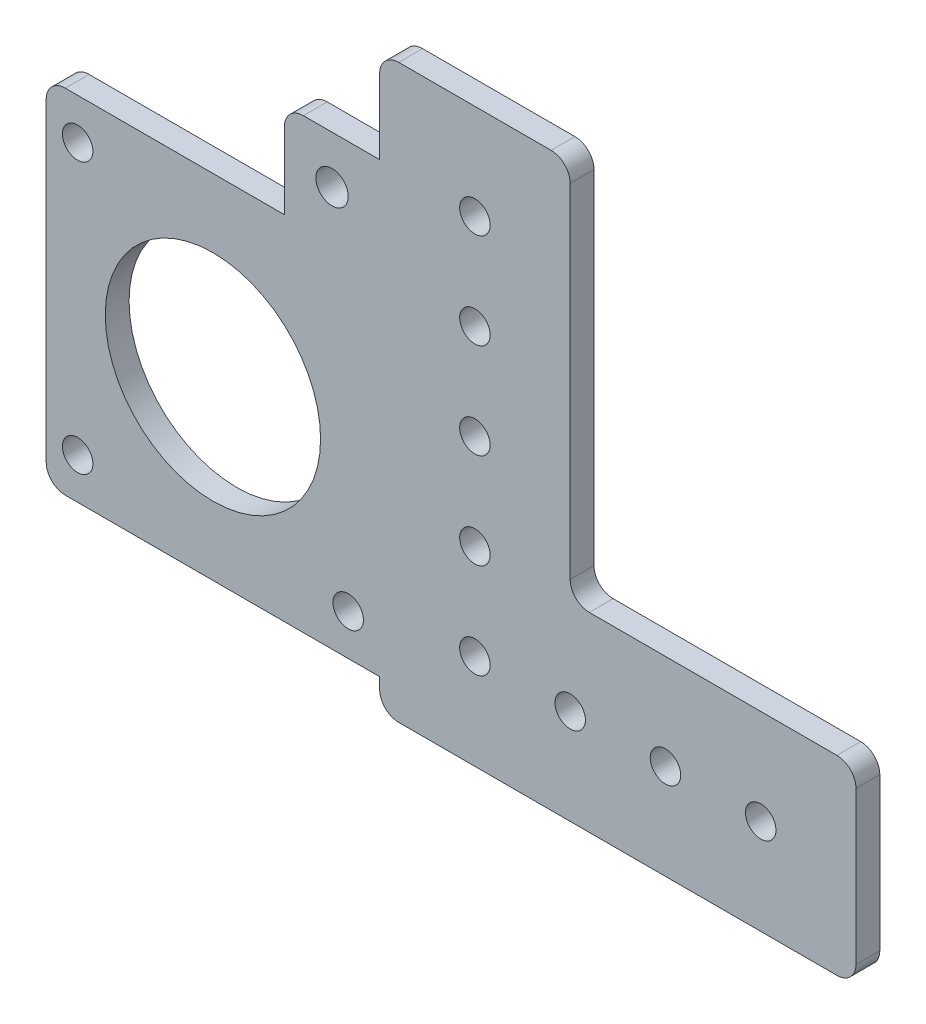
ISO-10303-21;
HEADER;
FILE_DESCRIPTION(('STEP AP214'),'2;1');
FILE_NAME('part.step','',(''),(''),'','','');
FILE_SCHEMA(('AUTOMOTIVE_DESIGN { 1 0 10303 214 1 1 1 1 }'));
ENDSEC;
DATA;
#1=APPLICATION_CONTEXT('core data for automotive mechanical design processes');
#2=APPLICATION_PROTOCOL_DEFINITION('international standard','automotive_design',2000,#1);
#3=PRODUCT_CONTEXT('',#1,'mechanical');
#4=PRODUCT('Part','Part','',(#3));
#5=PRODUCT_RELATED_PRODUCT_CATEGORY('part','',(#4));
#6=PRODUCT_DEFINITION_FORMATION('','',#4);
#7=PRODUCT_DEFINITION_CONTEXT('part definition',#1,'design');
#8=PRODUCT_DEFINITION('design','',#6,#7);
#9=PRODUCT_DEFINITION_SHAPE('','',#8);
#10=(LENGTH_UNIT() NAMED_UNIT(*) SI_UNIT(.MILLI.,.METRE.));
#11=(NAMED_UNIT(*) PLANE_ANGLE_UNIT() SI_UNIT($,.RADIAN.));
#12=(NAMED_UNIT(*) SI_UNIT($,.STERADIAN.) SOLID_ANGLE_UNIT());
#13=UNCERTAINTY_MEASURE_WITH_UNIT(LENGTH_MEASURE(1.E-05),#10,'distance_accuracy_value','');
#14=(GEOMETRIC_REPRESENTATION_CONTEXT(3) GLOBAL_UNCERTAINTY_ASSIGNED_CONTEXT((#13)) GLOBAL_UNIT_ASSIGNED_CONTEXT((#10,
#11,#12)) REPRESENTATION_CONTEXT('',''));
#15=CARTESIAN_POINT('',(0.,0.,0.));
#16=DIRECTION('',(0.,0.,1.));
#17=DIRECTION('',(1.,0.,0.));
#18=AXIS2_PLACEMENT_3D('',#15,#16,#17);
#19=CARTESIAN_POINT('',(12.7,0.,3.175));
#20=DIRECTION('',(-1.,0.,0.));
#21=DIRECTION('',(0.,-1.,0.));
#22=AXIS2_PLACEMENT_3D('',#19,#20,#21);
#23=PLANE('',#22);
#24=DIRECTION('',(0.,1.,0.));
#25=VECTOR('',#24,1.);
#26=CARTESIAN_POINT('',(12.7,0.,0.));
#27=LINE('',#26,#25);
#28=CARTESIAN_POINT('',(12.7,-10.16,0.));
#29=VERTEX_POINT('',#28);
#30=CARTESIAN_POINT('',(12.7,35.56,0.));
#31=VERTEX_POINT('',#30);
#32=EDGE_CURVE('E223',#29,#31,#27,.T.);
#33=ORIENTED_EDGE('',*,*,#32,.T.);
#34=DIRECTION('',(0.,0.,-1.));
#35=VECTOR('',#34,1.);
#36=CARTESIAN_POINT('',(12.7,35.56,3.175));
#37=LINE('',#36,#35);
#38=CARTESIAN_POINT('',(12.7,35.56,3.175));
#39=VERTEX_POINT('',#38);
#40=EDGE_CURVE('E310',#31,#39,#37,.F.);
#41=ORIENTED_EDGE('',*,*,#40,.T.);
#42=DIRECTION('',(0.,1.,0.));
#43=VECTOR('',#42,1.);
#44=CARTESIAN_POINT('',(12.7,0.,3.175));
#45=LINE('',#44,#43);
#46=CARTESIAN_POINT('',(12.7,-10.16,3.175));
#47=VERTEX_POINT('',#46);
#48=EDGE_CURVE('E408',#47,#39,#45,.T.);
#49=ORIENTED_EDGE('',*,*,#48,.F.);
#50=DIRECTION('',(0.,0.,1.));
#51=VECTOR('',#50,1.);
#52=CARTESIAN_POINT('',(12.7,-10.16,0.));
#53=LINE('',#52,#51);
#54=EDGE_CURVE('E308',#47,#29,#53,.F.);
#55=ORIENTED_EDGE('',*,*,#54,.T.);
#56=EDGE_LOOP('',(#33,#41,#49,#55));
#57=FACE_BOUND('',#56,.T.);
#58=ADVANCED_FACE('F34',(#57),#23,.F.);
#59=CARTESIAN_POINT('',(0.,-38.1,3.175));
#60=DIRECTION('',(0.,1.,0.));
#61=DIRECTION('',(0.,0.,1.));
#62=AXIS2_PLACEMENT_3D('',#59,#60,#61);
#63=PLANE('',#62);
#64=DIRECTION('',(1.,0.,0.));
#65=VECTOR('',#64,1.);
#66=CARTESIAN_POINT('',(0.,-38.1,3.175));
#67=LINE('',#66,#65);
#68=CARTESIAN_POINT('',(-10.16,-38.1,3.175));
#69=VERTEX_POINT('',#68);
#70=CARTESIAN_POINT('',(48.26,-38.1,3.175));
#71=VERTEX_POINT('',#70);
#72=EDGE_CURVE('E252',#69,#71,#67,.T.);
#73=ORIENTED_EDGE('',*,*,#72,.F.);
#74=DIRECTION('',(0.,0.,-1.));
#75=VECTOR('',#74,1.);
#76=CARTESIAN_POINT('',(-10.16,-38.1,0.));
#77=LINE('',#76,#75);
#78=CARTESIAN_POINT('',(-10.16,-38.1,0.));
#79=VERTEX_POINT('',#78);
#80=EDGE_CURVE('E257',#69,#79,#77,.T.);
#81=ORIENTED_EDGE('',*,*,#80,.T.);
#82=DIRECTION('',(1.,0.,0.));
#83=VECTOR('',#82,1.);
#84=CARTESIAN_POINT('',(0.,-38.1,0.));
#85=LINE('',#84,#83);
#86=CARTESIAN_POINT('',(48.26,-38.1,0.));
#87=VERTEX_POINT('',#86);
#88=EDGE_CURVE('E220',#79,#87,#85,.T.);
#89=ORIENTED_EDGE('',*,*,#88,.T.);
#90=DIRECTION('',(0.,0.,-1.));
#91=VECTOR('',#90,1.);
#92=CARTESIAN_POINT('',(48.26,-38.1,3.175));
#93=LINE('',#92,#91);
#94=EDGE_CURVE('E255',#87,#71,#93,.F.);
#95=ORIENTED_EDGE('',*,*,#94,.T.);
#96=EDGE_LOOP('',(#73,#81,#89,#95));
#97=FACE_BOUND('',#96,.T.);
#98=ADVANCED_FACE('F454',(#97),#63,.F.);
#99=CARTESIAN_POINT('',(0.,38.1,3.175));
#100=DIRECTION('',(0.,1.,0.));
#101=DIRECTION('',(0.,0.,1.));
#102=AXIS2_PLACEMENT_3D('',#99,#100,#101);
#103=PLANE('',#102);
#104=DIRECTION('',(1.,0.,0.));
#105=VECTOR('',#104,1.);
#106=CARTESIAN_POINT('',(0.,38.1,0.));
#107=LINE('',#106,#105);
#108=CARTESIAN_POINT('',(-10.16,38.1,0.));
#109=VERTEX_POINT('',#108);
#110=CARTESIAN_POINT('',(10.16,38.1,0.));
#111=VERTEX_POINT('',#110);
#112=EDGE_CURVE('E227',#109,#111,#107,.T.);
#113=ORIENTED_EDGE('',*,*,#112,.F.);
#114=DIRECTION('',(0.,0.,-1.));
#115=VECTOR('',#114,1.);
#116=CARTESIAN_POINT('',(-10.16,38.1,3.175));
#117=LINE('',#116,#115);
#118=CARTESIAN_POINT('',(-10.16,38.1,3.175));
#119=VERTEX_POINT('',#118);
#120=EDGE_CURVE('E306',#109,#119,#117,.F.);
#121=ORIENTED_EDGE('',*,*,#120,.T.);
#122=DIRECTION('',(1.,0.,0.));
#123=VECTOR('',#122,1.);
#124=CARTESIAN_POINT('',(0.,38.1,3.175));
#125=LINE('',#124,#123);
#126=CARTESIAN_POINT('',(10.16,38.1,3.175));
#127=VERTEX_POINT('',#126);
#128=EDGE_CURVE('E201',#119,#127,#125,.T.);
#129=ORIENTED_EDGE('',*,*,#128,.T.);
#130=DIRECTION('',(0.,0.,-1.));
#131=VECTOR('',#130,1.);
#132=CARTESIAN_POINT('',(10.16,38.1,0.));
#133=LINE('',#132,#131);
#134=EDGE_CURVE('E303',#127,#111,#133,.T.);
#135=ORIENTED_EDGE('',*,*,#134,.T.);
#136=EDGE_LOOP('',(#113,#121,#129,#135));
#137=FACE_BOUND('',#136,.T.);
#138=ADVANCED_FACE('F415',(#137),#103,.T.);
#139=CARTESIAN_POINT('',(-12.7,0.,3.175));
#140=DIRECTION('',(-1.,0.,0.));
#141=DIRECTION('',(0.,-1.,0.));
#142=AXIS2_PLACEMENT_3D('',#139,#140,#141);
#143=PLANE('',#142);
#144=DIRECTION('',(0.,0.,1.));
#145=VECTOR('',#144,1.);
#146=CARTESIAN_POINT('',(-12.7,25.595,-17.9605122421383));
#147=LINE('',#146,#145);
#148=CARTESIAN_POINT('',(-12.7,25.595,0.));
#149=VERTEX_POINT('',#148);
#150=CARTESIAN_POINT('',(-12.7,25.595,3.175));
#151=VERTEX_POINT('',#150);
#152=EDGE_CURVE('E190',#149,#151,#147,.T.);
#153=ORIENTED_EDGE('',*,*,#152,.T.);
#154=DIRECTION('',(0.,1.,0.));
#155=VECTOR('',#154,1.);
#156=CARTESIAN_POINT('',(-12.7,0.,3.175));
#157=LINE('',#156,#155);
#158=CARTESIAN_POINT('',(-12.7,35.56,3.175));
#159=VERTEX_POINT('',#158);
#160=EDGE_CURVE('E196',#151,#159,#157,.T.);
#161=ORIENTED_EDGE('',*,*,#160,.T.);
#162=DIRECTION('',(0.,0.,-1.));
#163=VECTOR('',#162,1.);
#164=CARTESIAN_POINT('',(-12.7,35.56,3.175));
#165=LINE('',#164,#163);
#166=CARTESIAN_POINT('',(-12.7,35.56,0.));
#167=VERTEX_POINT('',#166);
#168=EDGE_CURVE('E300',#159,#167,#165,.T.);
#169=ORIENTED_EDGE('',*,*,#168,.T.);
#170=DIRECTION('',(0.,1.,0.));
#171=VECTOR('',#170,1.);
#172=CARTESIAN_POINT('',(-12.7,0.,0.));
#173=LINE('',#172,#171);
#174=EDGE_CURVE('E230',#149,#167,#173,.T.);
#175=ORIENTED_EDGE('',*,*,#174,.F.);
#176=EDGE_LOOP('',(#153,#161,#169,#175));
#177=FACE_BOUND('',#176,.T.);
#178=ADVANCED_FACE('F583',(#177),#143,.T.);
#179=CARTESIAN_POINT('',(0.,12.895,3.175));
#180=DIRECTION('',(0.,1.,0.));
#181=DIRECTION('',(0.,0.,1.));
#182=AXIS2_PLACEMENT_3D('',#179,#180,#181);
#183=PLANE('',#182);
#184=DIRECTION('',(0.,0.,1.));
#185=VECTOR('',#184,1.);
#186=CARTESIAN_POINT('',(-25.4,12.895,-17.9605122421383));
#187=LINE('',#186,#185);
#188=CARTESIAN_POINT('',(-25.4,12.895,0.));
#189=VERTEX_POINT('',#188);
#190=CARTESIAN_POINT('',(-25.4,12.895,3.175));
#191=VERTEX_POINT('',#190);
#192=EDGE_CURVE('E184',#189,#191,#187,.T.);
#193=ORIENTED_EDGE('',*,*,#192,.F.);
#194=DIRECTION('',(1.,0.,0.));
#195=VECTOR('',#194,1.);
#196=CARTESIAN_POINT('',(0.,12.895,0.));
#197=LINE('',#196,#195);
#198=CARTESIAN_POINT('',(-54.61,12.895,0.));
#199=VERTEX_POINT('',#198);
#200=EDGE_CURVE('E232',#199,#189,#197,.T.);
#201=ORIENTED_EDGE('',*,*,#200,.F.);
#202=DIRECTION('',(0.,0.,-1.));
#203=VECTOR('',#202,1.);
#204=CARTESIAN_POINT('',(-54.61,12.895,3.175));
#205=LINE('',#204,#203);
#206=CARTESIAN_POINT('',(-54.61,12.895,3.175));
#207=VERTEX_POINT('',#206);
#208=EDGE_CURVE('E194',#199,#207,#205,.F.);
#209=ORIENTED_EDGE('',*,*,#208,.T.);
#210=DIRECTION('',(1.,0.,0.));
#211=VECTOR('',#210,1.);
#212=CARTESIAN_POINT('',(0.,12.895,3.175));
#213=LINE('',#212,#211);
#214=EDGE_CURVE('E178',#207,#191,#213,.T.);
#215=ORIENTED_EDGE('',*,*,#214,.T.);
#216=EDGE_LOOP('',(#193,#201,#209,#215));
#217=FACE_BOUND('',#216,.T.);
#218=ADVANCED_FACE('F192',(#217),#183,.T.);
#219=CARTESIAN_POINT('',(-57.15,0.,3.175));
#220=DIRECTION('',(-1.,0.,0.));
#221=DIRECTION('',(0.,0.,1.));
#222=AXIS2_PLACEMENT_3D('',#219,#220,#221);
#223=PLANE('',#222);
#224=DIRECTION('',(0.,1.,0.));
#225=VECTOR('',#224,1.);
#226=CARTESIAN_POINT('',(-57.15,0.,0.));
#227=LINE('',#226,#225);
#228=CARTESIAN_POINT('',(-57.15,-31.555,0.));
#229=VERTEX_POINT('',#228);
#230=CARTESIAN_POINT('',(-57.15,10.355,0.));
#231=VERTEX_POINT('',#230);
#232=EDGE_CURVE('E235',#229,#231,#227,.T.);
#233=ORIENTED_EDGE('',*,*,#232,.F.);
#234=DIRECTION('',(0.,0.,-1.));
#235=VECTOR('',#234,1.);
#236=CARTESIAN_POINT('',(-57.15,-31.555,3.175));
#237=LINE('',#236,#235);
#238=CARTESIAN_POINT('',(-57.15,-31.555,3.175));
#239=VERTEX_POINT('',#238);
#240=EDGE_CURVE('E297',#229,#239,#237,.F.);
#241=ORIENTED_EDGE('',*,*,#240,.T.);
#242=DIRECTION('',(0.,1.,0.));
#243=VECTOR('',#242,1.);
#244=CARTESIAN_POINT('',(-57.15,0.,3.175));
#245=LINE('',#244,#243);
#246=CARTESIAN_POINT('',(-57.15,10.355,3.175));
#247=VERTEX_POINT('',#246);
#248=EDGE_CURVE('E195',#239,#247,#245,.T.);
#249=ORIENTED_EDGE('',*,*,#248,.T.);
#250=DIRECTION('',(0.,0.,-1.));
#251=VECTOR('',#250,1.);
#252=CARTESIAN_POINT('',(-57.15,10.355,3.175));
#253=LINE('',#252,#251);
#254=EDGE_CURVE('E294',#247,#231,#253,.T.);
#255=ORIENTED_EDGE('',*,*,#254,.T.);
#256=EDGE_LOOP('',(#233,#241,#249,#255));
#257=FACE_BOUND('',#256,.T.);
#258=ADVANCED_FACE('F476',(#257),#223,.T.);
#259=CARTESIAN_POINT('',(0.,-34.095,3.175));
#260=DIRECTION('',(0.,1.,0.));
#261=DIRECTION('',(0.,0.,1.));
#262=AXIS2_PLACEMENT_3D('',#259,#260,#261);
#263=PLANE('',#262);
#264=DIRECTION('',(1.,0.,0.));
#265=VECTOR('',#264,1.);
#266=CARTESIAN_POINT('',(0.,-34.095,3.175));
#267=LINE('',#266,#265);
#268=CARTESIAN_POINT('',(-54.61,-34.095,3.175));
#269=VERTEX_POINT('',#268);
#270=CARTESIAN_POINT('',(-12.7,-34.095,3.175));
#271=VERTEX_POINT('',#270);
#272=EDGE_CURVE('E199',#269,#271,#267,.T.);
#273=ORIENTED_EDGE('',*,*,#272,.F.);
#274=DIRECTION('',(0.,0.,-1.));
#275=VECTOR('',#274,1.);
#276=CARTESIAN_POINT('',(-54.61,-34.095,0.));
#277=LINE('',#276,#275);
#278=CARTESIAN_POINT('',(-54.61,-34.095,0.));
#279=VERTEX_POINT('',#278);
#280=EDGE_CURVE('E291',#269,#279,#277,.T.);
#281=ORIENTED_EDGE('',*,*,#280,.T.);
#282=DIRECTION('',(1.,0.,0.));
#283=VECTOR('',#282,1.);
#284=CARTESIAN_POINT('',(0.,-34.095,0.));
#285=LINE('',#284,#283);
#286=CARTESIAN_POINT('',(-12.7,-34.095,0.));
#287=VERTEX_POINT('',#286);
#288=EDGE_CURVE('E238',#279,#287,#285,.T.);
#289=ORIENTED_EDGE('',*,*,#288,.T.);
#290=DIRECTION('',(0.,0.,-1.));
#291=VECTOR('',#290,1.);
#292=CARTESIAN_POINT('',(-12.7,-34.095,3.175));
#293=LINE('',#292,#291);
#294=EDGE_CURVE('E219',#271,#287,#293,.T.);
#295=ORIENTED_EDGE('',*,*,#294,.F.);
#296=EDGE_LOOP('',(#273,#281,#289,#295));
#297=FACE_BOUND('',#296,.T.);
#298=ADVANCED_FACE('F470',(#297),#263,.F.);
#299=CARTESIAN_POINT('',(-16.891,-28.634,3.175));
#300=DIRECTION('',(0.,0.,-1.));
#301=DIRECTION('',(-1.,0.,0.));
#302=AXIS2_PLACEMENT_3D('',#299,#300,#301);
#303=CYLINDRICAL_SURFACE('',#302,2.03200000000001);
#304=CARTESIAN_POINT('',(-16.891,-28.634,3.175));
#305=DIRECTION('',(0.,0.,1.));
#306=DIRECTION('',(1.,0.,0.));
#307=AXIS2_PLACEMENT_3D('',#304,#305,#306);
#308=CIRCLE('',#307,2.03200000000001);
#309=CARTESIAN_POINT('',(-14.859,-28.634,3.175));
#310=VERTEX_POINT('',#309);
#311=EDGE_CURVE('E213',#310,#310,#308,.T.);
#312=ORIENTED_EDGE('',*,*,#311,.T.);
#313=EDGE_LOOP('',(#312));
#314=FACE_BOUND('',#313,.T.);
#315=CARTESIAN_POINT('',(-16.891,-28.634,0.));
#316=DIRECTION('',(0.,0.,1.));
#317=DIRECTION('',(1.,0.,0.));
#318=AXIS2_PLACEMENT_3D('',#315,#316,#317);
#319=CIRCLE('',#318,2.03200000000001);
#320=CARTESIAN_POINT('',(-14.859,-28.634,0.));
#321=VERTEX_POINT('',#320);
#322=EDGE_CURVE('E246',#321,#321,#319,.T.);
#323=ORIENTED_EDGE('',*,*,#322,.F.);
#324=EDGE_LOOP('',(#323));
#325=FACE_BOUND('',#324,.T.);
#326=ADVANCED_FACE('F569',(#314,#325),#303,.F.);
#327=CARTESIAN_POINT('',(-52.959,7.434,3.175));
#328=DIRECTION('',(0.,0.,-1.));
#329=DIRECTION('',(-1.,0.,0.));
#330=AXIS2_PLACEMENT_3D('',#327,#328,#329);
#331=CYLINDRICAL_SURFACE('',#330,2.03200000000001);
#332=CARTESIAN_POINT('',(-52.959,7.434,3.175));
#333=DIRECTION('',(0.,0.,1.));
#334=DIRECTION('',(1.,0.,0.));
#335=AXIS2_PLACEMENT_3D('',#332,#333,#334);
#336=CIRCLE('',#335,2.03200000000001);
#337=CARTESIAN_POINT('',(-50.927,7.434,3.175));
#338=VERTEX_POINT('',#337);
#339=EDGE_CURVE('E210',#338,#338,#336,.T.);
#340=ORIENTED_EDGE('',*,*,#339,.T.);
#341=EDGE_LOOP('',(#340));
#342=FACE_BOUND('',#341,.T.);
#343=CARTESIAN_POINT('',(-52.959,7.434,0.));
#344=DIRECTION('',(0.,0.,1.));
#345=DIRECTION('',(1.,0.,0.));
#346=AXIS2_PLACEMENT_3D('',#343,#344,#345);
#347=CIRCLE('',#346,2.03200000000001);
#348=CARTESIAN_POINT('',(-50.927,7.434,0.));
#349=VERTEX_POINT('',#348);
#350=EDGE_CURVE('E243',#349,#349,#347,.T.);
#351=ORIENTED_EDGE('',*,*,#350,.F.);
#352=EDGE_LOOP('',(#351));
#353=FACE_BOUND('',#352,.T.);
#354=ADVANCED_FACE('F572',(#342,#353),#331,.F.);
#355=CARTESIAN_POINT('',(-34.925,-10.6,3.175));
#356=DIRECTION('',(0.,0.,-1.));
#357=DIRECTION('',(-1.,0.,0.));
#358=AXIS2_PLACEMENT_3D('',#355,#356,#357);
#359=CYLINDRICAL_SURFACE('',#358,14.351);
#360=CARTESIAN_POINT('',(-34.925,-10.6,3.175));
#361=DIRECTION('',(0.,0.,1.));
#362=DIRECTION('',(1.,0.,0.));
#363=AXIS2_PLACEMENT_3D('',#360,#361,#362);
#364=CIRCLE('',#363,14.351);
#365=CARTESIAN_POINT('',(-20.574,-10.6,3.175));
#366=VERTEX_POINT('',#365);
#367=EDGE_CURVE('E207',#366,#366,#364,.T.);
#368=ORIENTED_EDGE('',*,*,#367,.T.);
#369=EDGE_LOOP('',(#368));
#370=FACE_BOUND('',#369,.T.);
#371=CARTESIAN_POINT('',(-34.925,-10.6,0.));
#372=DIRECTION('',(0.,0.,1.));
#373=DIRECTION('',(1.,0.,0.));
#374=AXIS2_PLACEMENT_3D('',#371,#372,#373);
#375=CIRCLE('',#374,14.351);
#376=CARTESIAN_POINT('',(-20.574,-10.6,0.));
#377=VERTEX_POINT('',#376);
#378=EDGE_CURVE('E240',#377,#377,#375,.T.);
#379=ORIENTED_EDGE('',*,*,#378,.F.);
#380=EDGE_LOOP('',(#379));
#381=FACE_BOUND('',#380,.T.);
#382=ADVANCED_FACE('F576',(#370,#381),#359,.F.);
#383=CARTESIAN_POINT('',(-12.7,-35.56,0.));
#384=VERTEX_POINT('',#383);
#385=EDGE_CURVE('E233',#384,#287,#173,.T.);
#386=ORIENTED_EDGE('',*,*,#385,.F.);
#387=DIRECTION('',(0.,0.,-1.));
#388=VECTOR('',#387,1.);
#389=CARTESIAN_POINT('',(-12.7,-35.56,3.175));
#390=LINE('',#389,#388);
#391=CARTESIAN_POINT('',(-12.7,-35.56,3.175));
#392=VERTEX_POINT('',#391);
#393=EDGE_CURVE('E274',#384,#392,#390,.F.);
#394=ORIENTED_EDGE('',*,*,#393,.T.);
#395=EDGE_CURVE('E203',#392,#271,#157,.T.);
#396=ORIENTED_EDGE('',*,*,#395,.T.);
#397=ORIENTED_EDGE('',*,*,#294,.T.);
#398=EDGE_LOOP('',(#386,#394,#396,#397));
#399=FACE_BOUND('',#398,.T.);
#400=ADVANCED_FACE('F464',(#399),#143,.T.);
#401=CARTESIAN_POINT('',(-52.959,-28.634,3.175));
#402=DIRECTION('',(0.,0.,-1.));
#403=DIRECTION('',(-1.,0.,0.));
#404=AXIS2_PLACEMENT_3D('',#401,#402,#403);
#405=CYLINDRICAL_SURFACE('',#404,2.03200000000001);
#406=CARTESIAN_POINT('',(-52.959,-28.634,3.175));
#407=DIRECTION('',(0.,0.,1.));
#408=DIRECTION('',(1.,0.,0.));
#409=AXIS2_PLACEMENT_3D('',#406,#407,#408);
#410=CIRCLE('',#409,2.03200000000001);
#411=CARTESIAN_POINT('',(-50.927,-28.634,3.175));
#412=VERTEX_POINT('',#411);
#413=EDGE_CURVE('E216',#412,#412,#410,.F.);
#414=ORIENTED_EDGE('',*,*,#413,.F.);
#415=EDGE_LOOP('',(#414));
#416=FACE_BOUND('',#415,.T.);
#417=CARTESIAN_POINT('',(-52.959,-28.634,0.));
#418=DIRECTION('',(0.,0.,1.));
#419=DIRECTION('',(1.,0.,0.));
#420=AXIS2_PLACEMENT_3D('',#417,#418,#419);
#421=CIRCLE('',#420,2.03200000000001);
#422=CARTESIAN_POINT('',(-50.927,-28.634,0.));
#423=VERTEX_POINT('',#422);
#424=EDGE_CURVE('E249',#423,#423,#421,.F.);
#425=ORIENTED_EDGE('',*,*,#424,.T.);
#426=EDGE_LOOP('',(#425));
#427=FACE_BOUND('',#426,.T.);
#428=ADVANCED_FACE('F563',(#416,#427),#405,.F.);
#429=CARTESIAN_POINT('',(0.,0.,3.175));
#430=DIRECTION('',(0.,0.,1.));
#431=DIRECTION('',(1.,0.,0.));
#432=AXIS2_PLACEMENT_3D('',#429,#430,#431);
#433=PLANE('',#432);
#434=DIRECTION('',(-1.,0.,0.));
#435=VECTOR('',#434,1.);
#436=CARTESIAN_POINT('',(-12.7,25.595,3.175));
#437=LINE('',#436,#435);
#438=CARTESIAN_POINT('',(-22.86,25.595,3.175));
#439=VERTEX_POINT('',#438);
#440=EDGE_CURVE('E180',#151,#439,#437,.T.);
#441=ORIENTED_EDGE('',*,*,#440,.T.);
#442=CARTESIAN_POINT('',(-22.86,23.055,3.175));
#443=DIRECTION('',(0.,0.,1.));
#444=DIRECTION('',(1.,0.,0.));
#445=AXIS2_PLACEMENT_3D('',#442,#443,#444);
#446=CIRCLE('',#445,2.54);
#447=CARTESIAN_POINT('',(-25.4,23.055,3.175));
#448=VERTEX_POINT('',#447);
#449=EDGE_CURVE('E56',#439,#448,#446,.T.);
#450=ORIENTED_EDGE('',*,*,#449,.T.);
#451=DIRECTION('',(0.,-1.,0.));
#452=VECTOR('',#451,1.);
#453=CARTESIAN_POINT('',(-25.4,12.895,3.175));
#454=LINE('',#453,#452);
#455=EDGE_CURVE('E173',#448,#191,#454,.T.);
#456=ORIENTED_EDGE('',*,*,#455,.T.);
#457=ORIENTED_EDGE('',*,*,#214,.F.);
#458=CARTESIAN_POINT('',(-54.61,10.355,3.175));
#459=DIRECTION('',(0.,0.,1.));
#460=DIRECTION('',(1.,0.,0.));
#461=AXIS2_PLACEMENT_3D('',#458,#459,#460);
#462=CIRCLE('',#461,2.54);
#463=EDGE_CURVE('E285',#207,#247,#462,.T.);
#464=ORIENTED_EDGE('',*,*,#463,.T.);
#465=ORIENTED_EDGE('',*,*,#248,.F.);
#466=CARTESIAN_POINT('',(-54.61,-31.555,3.175));
#467=DIRECTION('',(0.,0.,1.));
#468=DIRECTION('',(1.,0.,0.));
#469=AXIS2_PLACEMENT_3D('',#466,#467,#468);
#470=CIRCLE('',#469,2.54);
#471=EDGE_CURVE('E287',#239,#269,#470,.T.);
#472=ORIENTED_EDGE('',*,*,#471,.T.);
#473=ORIENTED_EDGE('',*,*,#272,.T.);
#474=ORIENTED_EDGE('',*,*,#395,.F.);
#475=CARTESIAN_POINT('',(-10.16,-35.56,3.175));
#476=DIRECTION('',(0.,0.,1.));
#477=DIRECTION('',(1.,0.,0.));
#478=AXIS2_PLACEMENT_3D('',#475,#476,#477);
#479=CIRCLE('',#478,2.54);
#480=EDGE_CURVE('E289',#392,#69,#479,.T.);
#481=ORIENTED_EDGE('',*,*,#480,.T.);
#482=ORIENTED_EDGE('',*,*,#72,.T.);
#483=CARTESIAN_POINT('',(48.26,-35.56,3.175));
#484=DIRECTION('',(0.,0.,1.));
#485=DIRECTION('',(1.,0.,0.));
#486=AXIS2_PLACEMENT_3D('',#483,#484,#485);
#487=CIRCLE('',#486,2.54);
#488=CARTESIAN_POINT('',(50.8,-35.56,3.175));
#489=VERTEX_POINT('',#488);
#490=EDGE_CURVE('E276',#71,#489,#487,.T.);
#491=ORIENTED_EDGE('',*,*,#490,.T.);
#492=DIRECTION('',(0.,-1.,0.));
#493=VECTOR('',#492,1.);
#494=CARTESIAN_POINT('',(50.8,-38.1,3.175));
#495=LINE('',#494,#493);
#496=CARTESIAN_POINT('',(50.8,-15.24,3.175));
#497=VERTEX_POINT('',#496);
#498=EDGE_CURVE('E351',#497,#489,#495,.T.);
#499=ORIENTED_EDGE('',*,*,#498,.F.);
#500=CARTESIAN_POINT('',(48.26,-15.24,3.175));
#501=DIRECTION('',(0.,0.,1.));
#502=DIRECTION('',(1.,0.,0.));
#503=AXIS2_PLACEMENT_3D('',#500,#501,#502);
#504=CIRCLE('',#503,2.54);
#505=CARTESIAN_POINT('',(48.26,-12.7,3.175));
#506=VERTEX_POINT('',#505);
#507=EDGE_CURVE('E278',#497,#506,#504,.T.);
#508=ORIENTED_EDGE('',*,*,#507,.T.);
#509=DIRECTION('',(-1.,0.,0.));
#510=VECTOR('',#509,1.);
#511=CARTESIAN_POINT('',(50.8,-12.7,3.175));
#512=LINE('',#511,#510);
#513=CARTESIAN_POINT('',(15.24,-12.7,3.175));
#514=VERTEX_POINT('',#513);
#515=EDGE_CURVE('E371',#506,#514,#512,.T.);
#516=ORIENTED_EDGE('',*,*,#515,.T.);
#517=CARTESIAN_POINT('',(15.24,-10.16,3.175));
#518=DIRECTION('',(0.,0.,1.));
#519=DIRECTION('',(1.,0.,0.));
#520=AXIS2_PLACEMENT_3D('',#517,#518,#519);
#521=CIRCLE('',#520,2.54);
#522=EDGE_CURVE('E323',#514,#47,#521,.F.);
#523=ORIENTED_EDGE('',*,*,#522,.T.);
#524=ORIENTED_EDGE('',*,*,#48,.T.);
#525=CARTESIAN_POINT('',(10.16,35.56,3.175));
#526=DIRECTION('',(0.,0.,1.));
#527=DIRECTION('',(1.,0.,0.));
#528=AXIS2_PLACEMENT_3D('',#525,#526,#527);
#529=CIRCLE('',#528,2.54);
#530=EDGE_CURVE('E280',#39,#127,#529,.T.);
#531=ORIENTED_EDGE('',*,*,#530,.T.);
#532=ORIENTED_EDGE('',*,*,#128,.F.);
#533=CARTESIAN_POINT('',(-10.16,35.56,3.175));
#534=DIRECTION('',(0.,0.,1.));
#535=DIRECTION('',(1.,0.,0.));
#536=AXIS2_PLACEMENT_3D('',#533,#534,#535);
#537=CIRCLE('',#536,2.54);
#538=EDGE_CURVE('E282',#119,#159,#537,.T.);
#539=ORIENTED_EDGE('',*,*,#538,.T.);
#540=ORIENTED_EDGE('',*,*,#160,.F.);
#541=EDGE_LOOP('',(#441,#450,#456,#457,#464,#465,#472,#473,#474,#481,#482,#491,#499,#508,#516,
#523,#524,#531,#532,#539,#540));
#542=FACE_BOUND('',#541,.T.);
#543=CARTESIAN_POINT('',(12.7,-25.4000000000006,3.175));
#544=DIRECTION('',(0.,0.,-1.));
#545=DIRECTION('',(-1.,0.,0.));
#546=AXIS2_PLACEMENT_3D('',#543,#544,#545);
#547=CIRCLE('',#546,2.032);
#548=CARTESIAN_POINT('',(10.668,-25.4000000000006,3.175));
#549=VERTEX_POINT('',#548);
#550=EDGE_CURVE('E348',#549,#549,#547,.T.);
#551=ORIENTED_EDGE('',*,*,#550,.T.);
#552=EDGE_LOOP('',(#551));
#553=FACE_BOUND('',#552,.T.);
#554=CARTESIAN_POINT('',(25.4,-25.4000000000007,3.175));
#555=DIRECTION('',(0.,0.,-1.));
#556=DIRECTION('',(-1.,0.,0.));
#557=AXIS2_PLACEMENT_3D('',#554,#555,#556);
#558=CIRCLE('',#557,2.032);
#559=CARTESIAN_POINT('',(23.368,-25.4000000000007,3.175));
#560=VERTEX_POINT('',#559);
#561=EDGE_CURVE('E355',#560,#560,#558,.T.);
#562=ORIENTED_EDGE('',*,*,#561,.T.);
#563=EDGE_LOOP('',(#562));
#564=FACE_BOUND('',#563,.T.);
#565=CARTESIAN_POINT('',(38.1,-25.4000000000008,3.175));
#566=DIRECTION('',(0.,0.,-1.));
#567=DIRECTION('',(-1.,0.,0.));
#568=AXIS2_PLACEMENT_3D('',#565,#566,#567);
#569=CIRCLE('',#568,2.032);
#570=CARTESIAN_POINT('',(36.068,-25.4000000000008,3.175));
#571=VERTEX_POINT('',#570);
#572=EDGE_CURVE('E361',#571,#571,#569,.T.);
#573=ORIENTED_EDGE('',*,*,#572,.T.);
#574=EDGE_LOOP('',(#573));
#575=FACE_BOUND('',#574,.T.);
#576=CARTESIAN_POINT('',(0.,12.6999999999995,3.175));
#577=DIRECTION('',(0.,0.,1.));
#578=DIRECTION('',(1.,0.,0.));
#579=AXIS2_PLACEMENT_3D('',#576,#577,#578);
#580=CIRCLE('',#579,2.032);
#581=CARTESIAN_POINT('',(2.032,12.6999999999995,3.175));
#582=VERTEX_POINT('',#581);
#583=EDGE_CURVE('E382',#582,#582,#580,.T.);
#584=ORIENTED_EDGE('',*,*,#583,.F.);
#585=EDGE_LOOP('',(#584));
#586=FACE_BOUND('',#585,.T.);
#587=CARTESIAN_POINT('',(0.,25.3999999999995,3.175));
#588=DIRECTION('',(0.,0.,1.));
#589=DIRECTION('',(1.,0.,0.));
#590=AXIS2_PLACEMENT_3D('',#587,#588,#589);
#591=CIRCLE('',#590,2.032);
#592=CARTESIAN_POINT('',(2.032,25.3999999999995,3.175));
#593=VERTEX_POINT('',#592);
#594=EDGE_CURVE('E388',#593,#593,#591,.T.);
#595=ORIENTED_EDGE('',*,*,#594,.F.);
#596=EDGE_LOOP('',(#595));
#597=FACE_BOUND('',#596,.T.);
#598=CARTESIAN_POINT('',(0.,-12.7000000000005,3.175));
#599=DIRECTION('',(0.,0.,1.));
#600=DIRECTION('',(1.,0.,0.));
#601=AXIS2_PLACEMENT_3D('',#598,#599,#600);
#602=CIRCLE('',#601,2.032);
#603=CARTESIAN_POINT('',(2.032,-12.7000000000005,3.175));
#604=VERTEX_POINT('',#603);
#605=EDGE_CURVE('E394',#604,#604,#602,.T.);
#606=ORIENTED_EDGE('',*,*,#605,.F.);
#607=EDGE_LOOP('',(#606));
#608=FACE_BOUND('',#607,.T.);
#609=CARTESIAN_POINT('',(0.,-25.4000000000005,3.175));
#610=DIRECTION('',(0.,0.,1.));
#611=DIRECTION('',(1.,0.,0.));
#612=AXIS2_PLACEMENT_3D('',#609,#610,#611);
#613=CIRCLE('',#612,2.032);
#614=CARTESIAN_POINT('',(2.032,-25.4000000000005,3.175));
#615=VERTEX_POINT('',#614);
#616=EDGE_CURVE('E377',#615,#615,#613,.T.);
#617=ORIENTED_EDGE('',*,*,#616,.F.);
#618=EDGE_LOOP('',(#617));
#619=FACE_BOUND('',#618,.T.);
#620=CARTESIAN_POINT('',(0.,-5.13478148889135E-13,3.175));
#621=DIRECTION('',(0.,0.,1.));
#622=DIRECTION('',(1.,0.,0.));
#623=AXIS2_PLACEMENT_3D('',#620,#621,#622);
#624=CIRCLE('',#623,2.032);
#625=CARTESIAN_POINT('',(2.032,-5.13478148889135E-13,3.175));
#626=VERTEX_POINT('',#625);
#627=EDGE_CURVE('E381',#626,#626,#624,.T.);
#628=ORIENTED_EDGE('',*,*,#627,.F.);
#629=EDGE_LOOP('',(#628));
#630=FACE_BOUND('',#629,.T.);
#631=ORIENTED_EDGE('',*,*,#367,.F.);
#632=EDGE_LOOP('',(#631));
#633=FACE_BOUND('',#632,.T.);
#634=ORIENTED_EDGE('',*,*,#339,.F.);
#635=EDGE_LOOP('',(#634));
#636=FACE_BOUND('',#635,.T.);
#637=ORIENTED_EDGE('',*,*,#311,.F.);
#638=EDGE_LOOP('',(#637));
#639=FACE_BOUND('',#638,.T.);
#640=ORIENTED_EDGE('',*,*,#413,.T.);
#641=EDGE_LOOP('',(#640));
#642=FACE_BOUND('',#641,.T.);
#643=CARTESIAN_POINT('',(-19.05,19.245,3.175));
#644=DIRECTION('',(0.,0.,1.));
#645=DIRECTION('',(1.,0.,0.));
#646=AXIS2_PLACEMENT_3D('',#643,#644,#645);
#647=CIRCLE('',#646,2.159);
#648=CARTESIAN_POINT('',(-16.891,19.245,3.175));
#649=VERTEX_POINT('',#648);
#650=EDGE_CURVE('E181',#649,#649,#647,.T.);
#651=ORIENTED_EDGE('',*,*,#650,.F.);
#652=EDGE_LOOP('',(#651));
#653=FACE_BOUND('',#652,.T.);
#654=ADVANCED_FACE('F175',(#542,#553,#564,#575,#586,#597,#608,#619,#630,#633,#636,#639,#642,
#653),#433,.T.);
#655=CARTESIAN_POINT('',(0.,0.,0.));
#656=DIRECTION('',(0.,0.,1.));
#657=DIRECTION('',(1.,0.,0.));
#658=AXIS2_PLACEMENT_3D('',#655,#656,#657);
#659=PLANE('',#658);
#660=DIRECTION('',(0.,1.,0.));
#661=VECTOR('',#660,1.);
#662=CARTESIAN_POINT('',(-25.4,12.895,0.));
#663=LINE('',#662,#661);
#664=CARTESIAN_POINT('',(-25.4,23.055,0.));
#665=VERTEX_POINT('',#664);
#666=EDGE_CURVE('E186',#189,#665,#663,.T.);
#667=ORIENTED_EDGE('',*,*,#666,.T.);
#668=CARTESIAN_POINT('',(-22.86,23.055,0.));
#669=DIRECTION('',(0.,0.,1.));
#670=DIRECTION('',(1.,0.,0.));
#671=AXIS2_PLACEMENT_3D('',#668,#669,#670);
#672=CIRCLE('',#671,2.54);
#673=CARTESIAN_POINT('',(-22.86,25.595,0.));
#674=VERTEX_POINT('',#673);
#675=EDGE_CURVE('E11',#665,#674,#672,.F.);
#676=ORIENTED_EDGE('',*,*,#675,.T.);
#677=DIRECTION('',(1.,0.,0.));
#678=VECTOR('',#677,1.);
#679=CARTESIAN_POINT('',(-12.7,25.595,0.));
#680=LINE('',#679,#678);
#681=EDGE_CURVE('E336',#674,#149,#680,.T.);
#682=ORIENTED_EDGE('',*,*,#681,.T.);
#683=ORIENTED_EDGE('',*,*,#174,.T.);
#684=CARTESIAN_POINT('',(-10.16,35.56,0.));
#685=DIRECTION('',(0.,0.,1.));
#686=DIRECTION('',(1.,0.,0.));
#687=AXIS2_PLACEMENT_3D('',#684,#685,#686);
#688=CIRCLE('',#687,2.54);
#689=EDGE_CURVE('E266',#167,#109,#688,.F.);
#690=ORIENTED_EDGE('',*,*,#689,.T.);
#691=ORIENTED_EDGE('',*,*,#112,.T.);
#692=CARTESIAN_POINT('',(10.16,35.56,0.));
#693=DIRECTION('',(0.,0.,1.));
#694=DIRECTION('',(1.,0.,0.));
#695=AXIS2_PLACEMENT_3D('',#692,#693,#694);
#696=CIRCLE('',#695,2.54);
#697=EDGE_CURVE('E264',#111,#31,#696,.F.);
#698=ORIENTED_EDGE('',*,*,#697,.T.);
#699=ORIENTED_EDGE('',*,*,#32,.F.);
#700=CARTESIAN_POINT('',(15.24,-10.16,0.));
#701=DIRECTION('',(0.,0.,1.));
#702=DIRECTION('',(1.,0.,0.));
#703=AXIS2_PLACEMENT_3D('',#700,#701,#702);
#704=CIRCLE('',#703,2.54);
#705=CARTESIAN_POINT('',(15.24,-12.7,0.));
#706=VERTEX_POINT('',#705);
#707=EDGE_CURVE('E325',#29,#706,#704,.T.);
#708=ORIENTED_EDGE('',*,*,#707,.T.);
#709=DIRECTION('',(-1.,0.,0.));
#710=VECTOR('',#709,1.);
#711=CARTESIAN_POINT('',(50.8,-12.7,0.));
#712=LINE('',#711,#710);
#713=CARTESIAN_POINT('',(48.26,-12.7,0.));
#714=VERTEX_POINT('',#713);
#715=EDGE_CURVE('E374',#714,#706,#712,.T.);
#716=ORIENTED_EDGE('',*,*,#715,.F.);
#717=CARTESIAN_POINT('',(48.26,-15.24,0.));
#718=DIRECTION('',(0.,0.,1.));
#719=DIRECTION('',(1.,0.,0.));
#720=AXIS2_PLACEMENT_3D('',#717,#718,#719);
#721=CIRCLE('',#720,2.54);
#722=CARTESIAN_POINT('',(50.8,-15.24,0.));
#723=VERTEX_POINT('',#722);
#724=EDGE_CURVE('E262',#714,#723,#721,.F.);
#725=ORIENTED_EDGE('',*,*,#724,.T.);
#726=DIRECTION('',(0.,1.,0.));
#727=VECTOR('',#726,1.);
#728=CARTESIAN_POINT('',(50.8,-38.1,0.));
#729=LINE('',#728,#727);
#730=CARTESIAN_POINT('',(50.8,-35.56,0.));
#731=VERTEX_POINT('',#730);
#732=EDGE_CURVE('E368',#731,#723,#729,.T.);
#733=ORIENTED_EDGE('',*,*,#732,.F.);
#734=CARTESIAN_POINT('',(48.26,-35.56,0.));
#735=DIRECTION('',(0.,0.,1.));
#736=DIRECTION('',(1.,0.,0.));
#737=AXIS2_PLACEMENT_3D('',#734,#735,#736);
#738=CIRCLE('',#737,2.54);
#739=EDGE_CURVE('E260',#731,#87,#738,.F.);
#740=ORIENTED_EDGE('',*,*,#739,.T.);
#741=ORIENTED_EDGE('',*,*,#88,.F.);
#742=CARTESIAN_POINT('',(-10.16,-35.56,0.));
#743=DIRECTION('',(0.,0.,1.));
#744=DIRECTION('',(1.,0.,0.));
#745=AXIS2_PLACEMENT_3D('',#742,#743,#744);
#746=CIRCLE('',#745,2.54);
#747=EDGE_CURVE('E272',#79,#384,#746,.F.);
#748=ORIENTED_EDGE('',*,*,#747,.T.);
#749=ORIENTED_EDGE('',*,*,#385,.T.);
#750=ORIENTED_EDGE('',*,*,#288,.F.);
#751=CARTESIAN_POINT('',(-54.61,-31.555,0.));
#752=DIRECTION('',(0.,0.,1.));
#753=DIRECTION('',(1.,0.,0.));
#754=AXIS2_PLACEMENT_3D('',#751,#752,#753);
#755=CIRCLE('',#754,2.54);
#756=EDGE_CURVE('E270',#279,#229,#755,.F.);
#757=ORIENTED_EDGE('',*,*,#756,.T.);
#758=ORIENTED_EDGE('',*,*,#232,.T.);
#759=CARTESIAN_POINT('',(-54.61,10.355,0.));
#760=DIRECTION('',(0.,0.,1.));
#761=DIRECTION('',(1.,0.,0.));
#762=AXIS2_PLACEMENT_3D('',#759,#760,#761);
#763=CIRCLE('',#762,2.54);
#764=EDGE_CURVE('E268',#231,#199,#763,.F.);
#765=ORIENTED_EDGE('',*,*,#764,.T.);
#766=ORIENTED_EDGE('',*,*,#200,.T.);
#767=EDGE_LOOP('',(#667,#676,#682,#683,#690,#691,#698,#699,#708,#716,#725,#733,#740,#741,#748,
#749,#750,#757,#758,#765,#766));
#768=FACE_BOUND('',#767,.T.);
#769=CARTESIAN_POINT('',(12.7,-25.4000000000006,0.));
#770=DIRECTION('',(0.,0.,-1.));
#771=DIRECTION('',(-1.,0.,0.));
#772=AXIS2_PLACEMENT_3D('',#769,#770,#771);
#773=CIRCLE('',#772,2.032);
#774=CARTESIAN_POINT('',(10.668,-25.4000000000006,0.));
#775=VERTEX_POINT('',#774);
#776=EDGE_CURVE('E352',#775,#775,#773,.T.);
#777=ORIENTED_EDGE('',*,*,#776,.F.);
#778=EDGE_LOOP('',(#777));
#779=FACE_BOUND('',#778,.T.);
#780=CARTESIAN_POINT('',(25.4,-25.4000000000007,0.));
#781=DIRECTION('',(0.,0.,-1.));
#782=DIRECTION('',(-1.,0.,0.));
#783=AXIS2_PLACEMENT_3D('',#780,#781,#782);
#784=CIRCLE('',#783,2.032);
#785=CARTESIAN_POINT('',(23.368,-25.4000000000007,0.));
#786=VERTEX_POINT('',#785);
#787=EDGE_CURVE('E358',#786,#786,#784,.T.);
#788=ORIENTED_EDGE('',*,*,#787,.F.);
#789=EDGE_LOOP('',(#788));
#790=FACE_BOUND('',#789,.T.);
#791=CARTESIAN_POINT('',(38.1,-25.4000000000008,0.));
#792=DIRECTION('',(0.,0.,-1.));
#793=DIRECTION('',(-1.,0.,0.));
#794=AXIS2_PLACEMENT_3D('',#791,#792,#793);
#795=CIRCLE('',#794,2.032);
#796=CARTESIAN_POINT('',(36.068,-25.4000000000008,0.));
#797=VERTEX_POINT('',#796);
#798=EDGE_CURVE('E347',#797,#797,#795,.T.);
#799=ORIENTED_EDGE('',*,*,#798,.F.);
#800=EDGE_LOOP('',(#799));
#801=FACE_BOUND('',#800,.T.);
#802=CARTESIAN_POINT('',(0.,12.6999999999995,0.));
#803=DIRECTION('',(0.,0.,1.));
#804=DIRECTION('',(1.,0.,0.));
#805=AXIS2_PLACEMENT_3D('',#802,#803,#804);
#806=CIRCLE('',#805,2.032);
#807=CARTESIAN_POINT('',(2.032,12.6999999999995,0.));
#808=VERTEX_POINT('',#807);
#809=EDGE_CURVE('E378',#808,#808,#806,.T.);
#810=ORIENTED_EDGE('',*,*,#809,.T.);
#811=EDGE_LOOP('',(#810));
#812=FACE_BOUND('',#811,.T.);
#813=CARTESIAN_POINT('',(0.,25.3999999999995,0.));
#814=DIRECTION('',(0.,0.,1.));
#815=DIRECTION('',(1.,0.,0.));
#816=AXIS2_PLACEMENT_3D('',#813,#814,#815);
#817=CIRCLE('',#816,2.032);
#818=CARTESIAN_POINT('',(2.032,25.3999999999995,0.));
#819=VERTEX_POINT('',#818);
#820=EDGE_CURVE('E385',#819,#819,#817,.T.);
#821=ORIENTED_EDGE('',*,*,#820,.T.);
#822=EDGE_LOOP('',(#821));
#823=FACE_BOUND('',#822,.T.);
#824=CARTESIAN_POINT('',(0.,-12.7000000000005,0.));
#825=DIRECTION('',(0.,0.,1.));
#826=DIRECTION('',(1.,0.,0.));
#827=AXIS2_PLACEMENT_3D('',#824,#825,#826);
#828=CIRCLE('',#827,2.032);
#829=CARTESIAN_POINT('',(2.032,-12.7000000000005,0.));
#830=VERTEX_POINT('',#829);
#831=EDGE_CURVE('E391',#830,#830,#828,.T.);
#832=ORIENTED_EDGE('',*,*,#831,.T.);
#833=EDGE_LOOP('',(#832));
#834=FACE_BOUND('',#833,.T.);
#835=CARTESIAN_POINT('',(0.,-25.4000000000005,0.));
#836=DIRECTION('',(0.,0.,1.));
#837=DIRECTION('',(1.,0.,0.));
#838=AXIS2_PLACEMENT_3D('',#835,#836,#837);
#839=CIRCLE('',#838,2.032);
#840=CARTESIAN_POINT('',(2.032,-25.4000000000005,0.));
#841=VERTEX_POINT('',#840);
#842=EDGE_CURVE('E397',#841,#841,#839,.T.);
#843=ORIENTED_EDGE('',*,*,#842,.T.);
#844=EDGE_LOOP('',(#843));
#845=FACE_BOUND('',#844,.T.);
#846=CARTESIAN_POINT('',(0.,-5.13478148889135E-13,0.));
#847=DIRECTION('',(0.,0.,1.));
#848=DIRECTION('',(1.,0.,0.));
#849=AXIS2_PLACEMENT_3D('',#846,#847,#848);
#850=CIRCLE('',#849,2.032);
#851=CARTESIAN_POINT('',(2.032,-5.13478148889135E-13,0.));
#852=VERTEX_POINT('',#851);
#853=EDGE_CURVE('E224',#852,#852,#850,.T.);
#854=ORIENTED_EDGE('',*,*,#853,.T.);
#855=EDGE_LOOP('',(#854));
#856=FACE_BOUND('',#855,.T.);
#857=ORIENTED_EDGE('',*,*,#378,.T.);
#858=EDGE_LOOP('',(#857));
#859=FACE_BOUND('',#858,.T.);
#860=ORIENTED_EDGE('',*,*,#350,.T.);
#861=EDGE_LOOP('',(#860));
#862=FACE_BOUND('',#861,.T.);
#863=ORIENTED_EDGE('',*,*,#322,.T.);
#864=EDGE_LOOP('',(#863));
#865=FACE_BOUND('',#864,.T.);
#866=ORIENTED_EDGE('',*,*,#424,.F.);
#867=EDGE_LOOP('',(#866));
#868=FACE_BOUND('',#867,.T.);
#869=CARTESIAN_POINT('',(-19.05,19.245,0.));
#870=DIRECTION('',(0.,0.,1.));
#871=DIRECTION('',(1.,0.,0.));
#872=AXIS2_PLACEMENT_3D('',#869,#870,#871);
#873=CIRCLE('',#872,2.159);
#874=CARTESIAN_POINT('',(-16.891,19.245,0.));
#875=VERTEX_POINT('',#874);
#876=EDGE_CURVE('E344',#875,#875,#873,.F.);
#877=ORIENTED_EDGE('',*,*,#876,.F.);
#878=EDGE_LOOP('',(#877));
#879=FACE_BOUND('',#878,.T.);
#880=ADVANCED_FACE('F424',(#768,#779,#790,#801,#812,#823,#834,#845,#856,#859,#862,#865,#868,
#879),#659,.F.);
#881=CARTESIAN_POINT('',(0.,-5.13478148889135E-13,0.));
#882=DIRECTION('',(0.,0.,1.));
#883=DIRECTION('',(1.,0.,0.));
#884=AXIS2_PLACEMENT_3D('',#881,#882,#883);
#885=CYLINDRICAL_SURFACE('',#884,2.032);
#886=ORIENTED_EDGE('',*,*,#853,.F.);
#887=EDGE_LOOP('',(#886));
#888=FACE_BOUND('',#887,.T.);
#889=ORIENTED_EDGE('',*,*,#627,.T.);
#890=EDGE_LOOP('',(#889));
#891=FACE_BOUND('',#890,.T.);
#892=ADVANCED_FACE('F556',(#888,#891),#885,.F.);
#893=CARTESIAN_POINT('',(0.,-25.4000000000005,0.));
#894=DIRECTION('',(0.,0.,1.));
#895=DIRECTION('',(1.,0.,0.));
#896=AXIS2_PLACEMENT_3D('',#893,#894,#895);
#897=CYLINDRICAL_SURFACE('',#896,2.032);
#898=ORIENTED_EDGE('',*,*,#842,.F.);
#899=EDGE_LOOP('',(#898));
#900=FACE_BOUND('',#899,.T.);
#901=ORIENTED_EDGE('',*,*,#616,.T.);
#902=EDGE_LOOP('',(#901));
#903=FACE_BOUND('',#902,.T.);
#904=ADVANCED_FACE('F552',(#900,#903),#897,.F.);
#905=CARTESIAN_POINT('',(0.,-12.7000000000005,0.));
#906=DIRECTION('',(0.,0.,1.));
#907=DIRECTION('',(1.,0.,0.));
#908=AXIS2_PLACEMENT_3D('',#905,#906,#907);
#909=CYLINDRICAL_SURFACE('',#908,2.032);
#910=ORIENTED_EDGE('',*,*,#831,.F.);
#911=EDGE_LOOP('',(#910));
#912=FACE_BOUND('',#911,.T.);
#913=ORIENTED_EDGE('',*,*,#605,.T.);
#914=EDGE_LOOP('',(#913));
#915=FACE_BOUND('',#914,.T.);
#916=ADVANCED_FACE('F548',(#912,#915),#909,.F.);
#917=CARTESIAN_POINT('',(0.,25.3999999999995,0.));
#918=DIRECTION('',(0.,0.,1.));
#919=DIRECTION('',(1.,0.,0.));
#920=AXIS2_PLACEMENT_3D('',#917,#918,#919);
#921=CYLINDRICAL_SURFACE('',#920,2.032);
#922=ORIENTED_EDGE('',*,*,#820,.F.);
#923=EDGE_LOOP('',(#922));
#924=FACE_BOUND('',#923,.T.);
#925=ORIENTED_EDGE('',*,*,#594,.T.);
#926=EDGE_LOOP('',(#925));
#927=FACE_BOUND('',#926,.T.);
#928=ADVANCED_FACE('F544',(#924,#927),#921,.F.);
#929=CARTESIAN_POINT('',(0.,12.6999999999995,0.));
#930=DIRECTION('',(0.,0.,1.));
#931=DIRECTION('',(1.,0.,0.));
#932=AXIS2_PLACEMENT_3D('',#929,#930,#931);
#933=CYLINDRICAL_SURFACE('',#932,2.032);
#934=ORIENTED_EDGE('',*,*,#809,.F.);
#935=EDGE_LOOP('',(#934));
#936=FACE_BOUND('',#935,.T.);
#937=ORIENTED_EDGE('',*,*,#583,.T.);
#938=EDGE_LOOP('',(#937));
#939=FACE_BOUND('',#938,.T.);
#940=ADVANCED_FACE('F541',(#936,#939),#933,.F.);
#941=CARTESIAN_POINT('',(50.8,-12.7,3.175));
#942=DIRECTION('',(0.,-1.,0.));
#943=DIRECTION('',(1.,0.,0.));
#944=AXIS2_PLACEMENT_3D('',#941,#942,#943);
#945=PLANE('',#944);
#946=ORIENTED_EDGE('',*,*,#715,.T.);
#947=DIRECTION('',(0.,0.,1.));
#948=VECTOR('',#947,1.);
#949=CARTESIAN_POINT('',(15.24,-12.7,3.175));
#950=LINE('',#949,#948);
#951=EDGE_CURVE('E314',#706,#514,#950,.T.);
#952=ORIENTED_EDGE('',*,*,#951,.T.);
#953=ORIENTED_EDGE('',*,*,#515,.F.);
#954=DIRECTION('',(0.,0.,1.));
#955=VECTOR('',#954,1.);
#956=CARTESIAN_POINT('',(48.26,-12.7,3.175));
#957=LINE('',#956,#955);
#958=EDGE_CURVE('E312',#506,#714,#957,.F.);
#959=ORIENTED_EDGE('',*,*,#958,.T.);
#960=EDGE_LOOP('',(#946,#952,#953,#959));
#961=FACE_BOUND('',#960,.T.);
#962=ADVANCED_FACE('F436',(#961),#945,.F.);
#963=CARTESIAN_POINT('',(50.8,0.,0.));
#964=DIRECTION('',(-1.,0.,0.));
#965=DIRECTION('',(0.,-1.,0.));
#966=AXIS2_PLACEMENT_3D('',#963,#964,#965);
#967=PLANE('',#966);
#968=ORIENTED_EDGE('',*,*,#732,.T.);
#969=DIRECTION('',(0.,0.,1.));
#970=VECTOR('',#969,1.);
#971=CARTESIAN_POINT('',(50.8,-15.24,0.));
#972=LINE('',#971,#970);
#973=EDGE_CURVE('E320',#723,#497,#972,.T.);
#974=ORIENTED_EDGE('',*,*,#973,.T.);
#975=ORIENTED_EDGE('',*,*,#498,.T.);
#976=DIRECTION('',(0.,0.,-1.));
#977=VECTOR('',#976,1.);
#978=CARTESIAN_POINT('',(50.8,-35.56,0.));
#979=LINE('',#978,#977);
#980=EDGE_CURVE('E317',#489,#731,#979,.T.);
#981=ORIENTED_EDGE('',*,*,#980,.T.);
#982=EDGE_LOOP('',(#968,#974,#975,#981));
#983=FACE_BOUND('',#982,.T.);
#984=ADVANCED_FACE('F444',(#983),#967,.F.);
#985=CARTESIAN_POINT('',(38.1,-25.4000000000008,3.175));
#986=DIRECTION('',(0.,0.,-1.));
#987=DIRECTION('',(-1.,0.,0.));
#988=AXIS2_PLACEMENT_3D('',#985,#986,#987);
#989=CYLINDRICAL_SURFACE('',#988,2.032);
#990=ORIENTED_EDGE('',*,*,#572,.F.);
#991=EDGE_LOOP('',(#990));
#992=FACE_BOUND('',#991,.T.);
#993=ORIENTED_EDGE('',*,*,#798,.T.);
#994=EDGE_LOOP('',(#993));
#995=FACE_BOUND('',#994,.T.);
#996=ADVANCED_FACE('F532',(#992,#995),#989,.F.);
#997=CARTESIAN_POINT('',(25.4,-25.4000000000007,3.175));
#998=DIRECTION('',(0.,0.,-1.));
#999=DIRECTION('',(-1.,0.,0.));
#1000=AXIS2_PLACEMENT_3D('',#997,#998,#999);
#1001=CYLINDRICAL_SURFACE('',#1000,2.032);
#1002=ORIENTED_EDGE('',*,*,#561,.F.);
#1003=EDGE_LOOP('',(#1002));
#1004=FACE_BOUND('',#1003,.T.);
#1005=ORIENTED_EDGE('',*,*,#787,.T.);
#1006=EDGE_LOOP('',(#1005));
#1007=FACE_BOUND('',#1006,.T.);
#1008=ADVANCED_FACE('F528',(#1004,#1007),#1001,.F.);
#1009=CARTESIAN_POINT('',(12.7,-25.4000000000006,3.175));
#1010=DIRECTION('',(0.,0.,-1.));
#1011=DIRECTION('',(-1.,0.,0.));
#1012=AXIS2_PLACEMENT_3D('',#1009,#1010,#1011);
#1013=CYLINDRICAL_SURFACE('',#1012,2.032);
#1014=ORIENTED_EDGE('',*,*,#550,.F.);
#1015=EDGE_LOOP('',(#1014));
#1016=FACE_BOUND('',#1015,.T.);
#1017=ORIENTED_EDGE('',*,*,#776,.T.);
#1018=EDGE_LOOP('',(#1017));
#1019=FACE_BOUND('',#1018,.T.);
#1020=ADVANCED_FACE('F502',(#1016,#1019),#1013,.F.);
#1021=CARTESIAN_POINT('',(-10.16,-35.56,3.175));
#1022=DIRECTION('',(0.,0.,1.));
#1023=DIRECTION('',(1.,0.,0.));
#1024=AXIS2_PLACEMENT_3D('',#1021,#1022,#1023);
#1025=CYLINDRICAL_SURFACE('',#1024,2.54);
#1026=ORIENTED_EDGE('',*,*,#480,.F.);
#1027=ORIENTED_EDGE('',*,*,#393,.F.);
#1028=ORIENTED_EDGE('',*,*,#747,.F.);
#1029=ORIENTED_EDGE('',*,*,#80,.F.);
#1030=EDGE_LOOP('',(#1026,#1027,#1028,#1029));
#1031=FACE_BOUND('',#1030,.T.);
#1032=ADVANCED_FACE('F458',(#1031),#1025,.T.);
#1033=CARTESIAN_POINT('',(-54.61,-31.555,3.175));
#1034=DIRECTION('',(0.,0.,1.));
#1035=DIRECTION('',(1.,0.,0.));
#1036=AXIS2_PLACEMENT_3D('',#1033,#1034,#1035);
#1037=CYLINDRICAL_SURFACE('',#1036,2.54);
#1038=ORIENTED_EDGE('',*,*,#471,.F.);
#1039=ORIENTED_EDGE('',*,*,#240,.F.);
#1040=ORIENTED_EDGE('',*,*,#756,.F.);
#1041=ORIENTED_EDGE('',*,*,#280,.F.);
#1042=EDGE_LOOP('',(#1038,#1039,#1040,#1041));
#1043=FACE_BOUND('',#1042,.T.);
#1044=ADVANCED_FACE('F480',(#1043),#1037,.T.);
#1045=CARTESIAN_POINT('',(-54.61,10.355,3.175));
#1046=DIRECTION('',(0.,0.,-1.));
#1047=DIRECTION('',(-1.,0.,0.));
#1048=AXIS2_PLACEMENT_3D('',#1045,#1046,#1047);
#1049=CYLINDRICAL_SURFACE('',#1048,2.54);
#1050=ORIENTED_EDGE('',*,*,#463,.F.);
#1051=ORIENTED_EDGE('',*,*,#208,.F.);
#1052=ORIENTED_EDGE('',*,*,#764,.F.);
#1053=ORIENTED_EDGE('',*,*,#254,.F.);
#1054=EDGE_LOOP('',(#1050,#1051,#1052,#1053));
#1055=FACE_BOUND('',#1054,.T.);
#1056=ADVANCED_FACE('F482',(#1055),#1049,.T.);
#1057=CARTESIAN_POINT('',(-10.16,35.56,3.175));
#1058=DIRECTION('',(0.,0.,-1.));
#1059=DIRECTION('',(-1.,0.,0.));
#1060=AXIS2_PLACEMENT_3D('',#1057,#1058,#1059);
#1061=CYLINDRICAL_SURFACE('',#1060,2.54);
#1062=ORIENTED_EDGE('',*,*,#538,.F.);
#1063=ORIENTED_EDGE('',*,*,#120,.F.);
#1064=ORIENTED_EDGE('',*,*,#689,.F.);
#1065=ORIENTED_EDGE('',*,*,#168,.F.);
#1066=EDGE_LOOP('',(#1062,#1063,#1064,#1065));
#1067=FACE_BOUND('',#1066,.T.);
#1068=ADVANCED_FACE('F507',(#1067),#1061,.T.);
#1069=CARTESIAN_POINT('',(10.16,35.56,3.175));
#1070=DIRECTION('',(0.,0.,1.));
#1071=DIRECTION('',(1.,0.,0.));
#1072=AXIS2_PLACEMENT_3D('',#1069,#1070,#1071);
#1073=CYLINDRICAL_SURFACE('',#1072,2.54);
#1074=ORIENTED_EDGE('',*,*,#530,.F.);
#1075=ORIENTED_EDGE('',*,*,#40,.F.);
#1076=ORIENTED_EDGE('',*,*,#697,.F.);
#1077=ORIENTED_EDGE('',*,*,#134,.F.);
#1078=EDGE_LOOP('',(#1074,#1075,#1076,#1077));
#1079=FACE_BOUND('',#1078,.T.);
#1080=ADVANCED_FACE('F420',(#1079),#1073,.T.);
#1081=CARTESIAN_POINT('',(15.24,-10.16,3.175));
#1082=DIRECTION('',(0.,0.,-1.));
#1083=DIRECTION('',(-1.,0.,0.));
#1084=AXIS2_PLACEMENT_3D('',#1081,#1082,#1083);
#1085=CYLINDRICAL_SURFACE('',#1084,2.54);
#1086=ORIENTED_EDGE('',*,*,#707,.F.);
#1087=ORIENTED_EDGE('',*,*,#54,.F.);
#1088=ORIENTED_EDGE('',*,*,#522,.F.);
#1089=ORIENTED_EDGE('',*,*,#951,.F.);
#1090=EDGE_LOOP('',(#1086,#1087,#1088,#1089));
#1091=FACE_BOUND('',#1090,.T.);
#1092=ADVANCED_FACE('F431',(#1091),#1085,.F.);
#1093=CARTESIAN_POINT('',(48.26,-15.24,0.));
#1094=DIRECTION('',(0.,0.,1.));
#1095=DIRECTION('',(1.,0.,0.));
#1096=AXIS2_PLACEMENT_3D('',#1093,#1094,#1095);
#1097=CYLINDRICAL_SURFACE('',#1096,2.54);
#1098=ORIENTED_EDGE('',*,*,#724,.F.);
#1099=ORIENTED_EDGE('',*,*,#958,.F.);
#1100=ORIENTED_EDGE('',*,*,#507,.F.);
#1101=ORIENTED_EDGE('',*,*,#973,.F.);
#1102=EDGE_LOOP('',(#1098,#1099,#1100,#1101));
#1103=FACE_BOUND('',#1102,.T.);
#1104=ADVANCED_FACE('F440',(#1103),#1097,.T.);
#1105=CARTESIAN_POINT('',(48.26,-35.56,0.));
#1106=DIRECTION('',(0.,0.,-1.));
#1107=DIRECTION('',(-1.,0.,0.));
#1108=AXIS2_PLACEMENT_3D('',#1105,#1106,#1107);
#1109=CYLINDRICAL_SURFACE('',#1108,2.54);
#1110=ORIENTED_EDGE('',*,*,#490,.F.);
#1111=ORIENTED_EDGE('',*,*,#94,.F.);
#1112=ORIENTED_EDGE('',*,*,#739,.F.);
#1113=ORIENTED_EDGE('',*,*,#980,.F.);
#1114=EDGE_LOOP('',(#1110,#1111,#1112,#1113));
#1115=FACE_BOUND('',#1114,.T.);
#1116=ADVANCED_FACE('F449',(#1115),#1109,.T.);
#1117=CARTESIAN_POINT('',(-12.7,25.595,-17.9605122421383));
#1118=DIRECTION('',(0.,1.,0.));
#1119=DIRECTION('',(0.,0.,1.));
#1120=AXIS2_PLACEMENT_3D('',#1117,#1118,#1119);
#1121=PLANE('',#1120);
#1122=ORIENTED_EDGE('',*,*,#681,.F.);
#1123=DIRECTION('',(0.,0.,1.));
#1124=VECTOR('',#1123,1.);
#1125=CARTESIAN_POINT('',(-22.86,25.595,-17.9605122421383));
#1126=LINE('',#1125,#1124);
#1127=EDGE_CURVE('E327',#674,#439,#1126,.T.);
#1128=ORIENTED_EDGE('',*,*,#1127,.T.);
#1129=ORIENTED_EDGE('',*,*,#440,.F.);
#1130=ORIENTED_EDGE('',*,*,#152,.F.);
#1131=EDGE_LOOP('',(#1122,#1128,#1129,#1130));
#1132=FACE_BOUND('',#1131,.T.);
#1133=ADVANCED_FACE('F333',(#1132),#1121,.T.);
#1134=CARTESIAN_POINT('',(-25.4,12.895,-17.9605122421383));
#1135=DIRECTION('',(-1.,0.,0.));
#1136=DIRECTION('',(0.,0.,1.));
#1137=AXIS2_PLACEMENT_3D('',#1134,#1135,#1136);
#1138=PLANE('',#1137);
#1139=ORIENTED_EDGE('',*,*,#455,.F.);
#1140=DIRECTION('',(0.,0.,1.));
#1141=VECTOR('',#1140,1.);
#1142=CARTESIAN_POINT('',(-25.4,23.055,-17.9605122421383));
#1143=LINE('',#1142,#1141);
#1144=EDGE_CURVE('E42',#448,#665,#1143,.F.);
#1145=ORIENTED_EDGE('',*,*,#1144,.T.);
#1146=ORIENTED_EDGE('',*,*,#666,.F.);
#1147=ORIENTED_EDGE('',*,*,#192,.T.);
#1148=EDGE_LOOP('',(#1139,#1145,#1146,#1147));
#1149=FACE_BOUND('',#1148,.T.);
#1150=ADVANCED_FACE('F185',(#1149),#1138,.T.);
#1151=CARTESIAN_POINT('',(-19.05,19.245,-17.9605122421383));
#1152=DIRECTION('',(0.,0.,1.));
#1153=DIRECTION('',(1.,0.,0.));
#1154=AXIS2_PLACEMENT_3D('',#1151,#1152,#1153);
#1155=CYLINDRICAL_SURFACE('',#1154,2.159);
#1156=ORIENTED_EDGE('',*,*,#876,.T.);
#1157=EDGE_LOOP('',(#1156));
#1158=FACE_BOUND('',#1157,.T.);
#1159=ORIENTED_EDGE('',*,*,#650,.T.);
#1160=EDGE_LOOP('',(#1159));
#1161=FACE_BOUND('',#1160,.T.);
#1162=ADVANCED_FACE('F485',(#1158,#1161),#1155,.F.);
#1163=CARTESIAN_POINT('',(-22.86,23.055,-17.9605122421383));
#1164=DIRECTION('',(0.,0.,1.));
#1165=DIRECTION('',(1.,0.,0.));
#1166=AXIS2_PLACEMENT_3D('',#1163,#1164,#1165);
#1167=CYLINDRICAL_SURFACE('',#1166,2.54);
#1168=ORIENTED_EDGE('',*,*,#675,.F.);
#1169=ORIENTED_EDGE('',*,*,#1144,.F.);
#1170=ORIENTED_EDGE('',*,*,#449,.F.);
#1171=ORIENTED_EDGE('',*,*,#1127,.F.);
#1172=EDGE_LOOP('',(#1168,#1169,#1170,#1171));
#1173=FACE_BOUND('',#1172,.T.);
#1174=ADVANCED_FACE('F36',(#1173),#1167,.T.);
#1175=CLOSED_SHELL('',(#58,#98,#138,#178,#218,#258,#298,#326,#354,#382,#400,#428,#654,#880,#892,
#904,#916,#928,#940,#962,#984,#996,#1008,#1020,#1032,#1044,#1056,#1068,#1080,#1092,#1104,#1116,
#1133,#1150,#1162,#1174));
#1176=MANIFOLD_SOLID_BREP('B2',#1175);
#1177=ADVANCED_BREP_SHAPE_REPRESENTATION('',(#18,#1176),#14);
#1178=SHAPE_DEFINITION_REPRESENTATION(#9,#1177);
ENDSEC;
END-ISO-10303-21;
